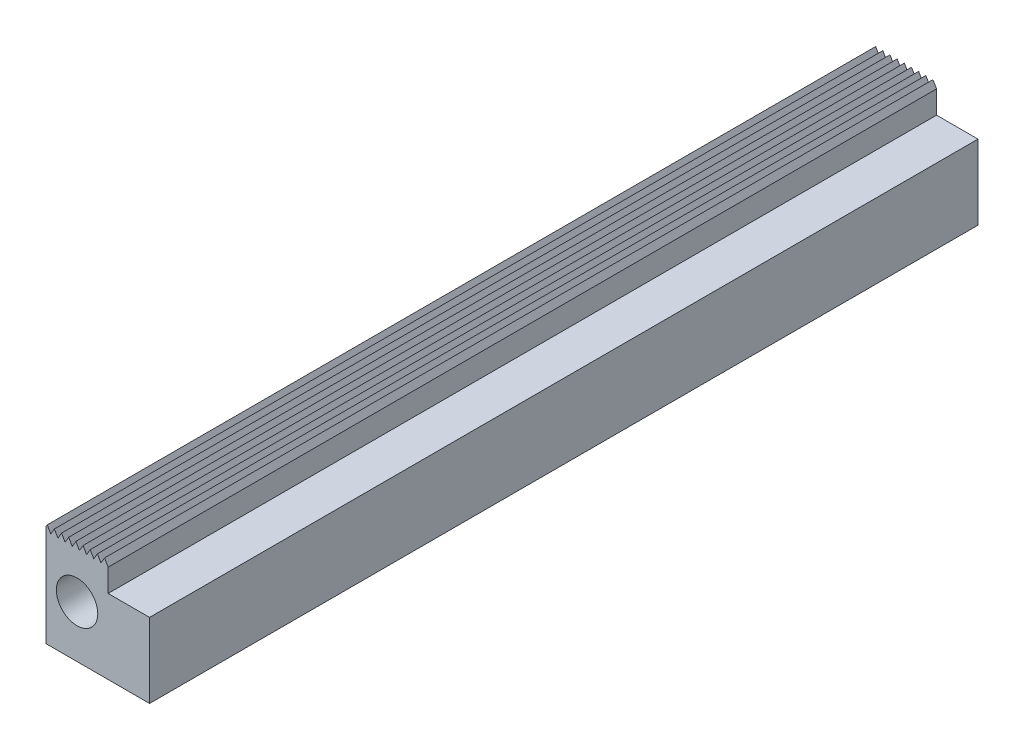
ISO-10303-21;
HEADER;
FILE_DESCRIPTION(('STEP AP214'),'2;1');
FILE_NAME('part.step','',(''),(''),'','','');
FILE_SCHEMA(('AUTOMOTIVE_DESIGN { 1 0 10303 214 1 1 1 1 }'));
ENDSEC;
DATA;
#1=APPLICATION_CONTEXT('core data for automotive mechanical design processes');
#2=APPLICATION_PROTOCOL_DEFINITION('international standard','automotive_design',2000,#1);
#3=PRODUCT_CONTEXT('',#1,'mechanical');
#4=PRODUCT('Part','Part','',(#3));
#5=PRODUCT_RELATED_PRODUCT_CATEGORY('part','',(#4));
#6=PRODUCT_DEFINITION_FORMATION('','',#4);
#7=PRODUCT_DEFINITION_CONTEXT('part definition',#1,'design');
#8=PRODUCT_DEFINITION('design','',#6,#7);
#9=PRODUCT_DEFINITION_SHAPE('','',#8);
#10=(LENGTH_UNIT() NAMED_UNIT(*) SI_UNIT(.MILLI.,.METRE.));
#11=(NAMED_UNIT(*) PLANE_ANGLE_UNIT() SI_UNIT($,.RADIAN.));
#12=(NAMED_UNIT(*) SI_UNIT($,.STERADIAN.) SOLID_ANGLE_UNIT());
#13=UNCERTAINTY_MEASURE_WITH_UNIT(LENGTH_MEASURE(1.E-05),#10,'distance_accuracy_value','');
#14=(GEOMETRIC_REPRESENTATION_CONTEXT(3) GLOBAL_UNCERTAINTY_ASSIGNED_CONTEXT((#13)) GLOBAL_UNIT_ASSIGNED_CONTEXT((#10,
#11,#12)) REPRESENTATION_CONTEXT('',''));
#15=CARTESIAN_POINT('',(0.,0.,0.));
#16=DIRECTION('',(0.,0.,1.));
#17=DIRECTION('',(1.,0.,0.));
#18=AXIS2_PLACEMENT_3D('',#15,#16,#17);
#19=CARTESIAN_POINT('',(-4.18717782649205,2.41746824527002,200.));
#20=DIRECTION('',(0.866025403784439,-0.5,0.));
#21=DIRECTION('',(0.5,0.866025403784439,0.));
#22=AXIS2_PLACEMENT_3D('',#19,#20,#21);
#23=PLANE('',#22);
#24=DIRECTION('',(-0.5,-0.866025403784439,0.));
#25=VECTOR('',#24,1.);
#26=CARTESIAN_POINT('',(-4.18717782649205,2.41746824527002,0.));
#27=LINE('',#26,#25);
#28=CARTESIAN_POINT('',(1.63397459621382,12.4999999999993,0.));
#29=VERTEX_POINT('',#28);
#30=CARTESIAN_POINT('',(0.768974596213908,11.0017760514523,0.));
#31=VERTEX_POINT('',#30);
#32=EDGE_CURVE('E234',#29,#31,#27,.T.);
#33=ORIENTED_EDGE('',*,*,#32,.T.);
#34=DIRECTION('',(0.,0.,-1.));
#35=VECTOR('',#34,1.);
#36=CARTESIAN_POINT('',(0.768974596213908,11.0017760514523,200.));
#37=LINE('',#36,#35);
#38=CARTESIAN_POINT('',(0.768974596213908,11.0017760514523,200.));
#39=VERTEX_POINT('',#38);
#40=EDGE_CURVE('E12',#39,#31,#37,.T.);
#41=ORIENTED_EDGE('',*,*,#40,.F.);
#42=DIRECTION('',(-0.5,-0.866025403784439,0.));
#43=VECTOR('',#42,1.);
#44=CARTESIAN_POINT('',(-4.18717782649205,2.41746824527002,200.));
#45=LINE('',#44,#43);
#46=CARTESIAN_POINT('',(1.63397459621382,12.4999999999993,200.));
#47=VERTEX_POINT('',#46);
#48=EDGE_CURVE('E285',#47,#39,#45,.T.);
#49=ORIENTED_EDGE('',*,*,#48,.F.);
#50=DIRECTION('',(0.,0.,-1.));
#51=VECTOR('',#50,1.);
#52=CARTESIAN_POINT('',(1.63397459621382,12.4999999999993,200.));
#53=LINE('',#52,#51);
#54=EDGE_CURVE('E233',#47,#29,#53,.T.);
#55=ORIENTED_EDGE('',*,*,#54,.T.);
#56=EDGE_LOOP('',(#33,#41,#49,#55));
#57=FACE_BOUND('',#56,.T.);
#58=ADVANCED_FACE('F43',(#57),#23,.F.);
#59=CARTESIAN_POINT('',(5.34063972081292,3.08341978045615,200.));
#60=DIRECTION('',(-0.866025403784439,-0.5,0.));
#61=DIRECTION('',(0.5,-0.866025403784439,0.));
#62=AXIS2_PLACEMENT_3D('',#59,#60,#61);
#63=PLANE('',#62);
#64=DIRECTION('',(-0.5,0.866025403784439,0.));
#65=VECTOR('',#64,1.);
#66=CARTESIAN_POINT('',(5.34063972081292,3.08341978045615,0.));
#67=LINE('',#66,#65);
#68=CARTESIAN_POINT('',(-0.0960254037859938,12.4999999999992,0.));
#69=VERTEX_POINT('',#68);
#70=EDGE_CURVE('E237',#31,#69,#67,.T.);
#71=ORIENTED_EDGE('',*,*,#70,.T.);
#72=DIRECTION('',(0.,0.,-1.));
#73=VECTOR('',#72,1.);
#74=CARTESIAN_POINT('',(-0.0960254037859938,12.4999999999992,200.));
#75=LINE('',#74,#73);
#76=CARTESIAN_POINT('',(-0.0960254037859938,12.4999999999992,200.));
#77=VERTEX_POINT('',#76);
#78=EDGE_CURVE('E51',#77,#69,#75,.T.);
#79=ORIENTED_EDGE('',*,*,#78,.F.);
#80=DIRECTION('',(-0.5,0.866025403784439,0.));
#81=VECTOR('',#80,1.);
#82=CARTESIAN_POINT('',(5.34063972081292,3.08341978045615,200.));
#83=LINE('',#82,#81);
#84=EDGE_CURVE('E146',#39,#77,#83,.T.);
#85=ORIENTED_EDGE('',*,*,#84,.F.);
#86=ORIENTED_EDGE('',*,*,#40,.T.);
#87=EDGE_LOOP('',(#71,#79,#85,#86));
#88=FACE_BOUND('',#87,.T.);
#89=ADVANCED_FACE('F439',(#88),#63,.F.);
#90=CARTESIAN_POINT('',(-5.48467782649251,3.16658021954454,200.));
#91=DIRECTION('',(0.86602540378439,-0.500000000000085,0.));
#92=DIRECTION('',(0.500000000000085,0.86602540378439,0.));
#93=AXIS2_PLACEMENT_3D('',#90,#91,#92);
#94=PLANE('',#93);
#95=DIRECTION('',(-0.500000000000085,-0.86602540378439,0.));
#96=VECTOR('',#95,1.);
#97=CARTESIAN_POINT('',(-5.48467782649251,3.16658021954454,0.));
#98=LINE('',#97,#96);
#99=CARTESIAN_POINT('',(-0.961025403786092,11.0017760514523,0.));
#100=VERTEX_POINT('',#99);
#101=EDGE_CURVE('E240',#69,#100,#98,.T.);
#102=ORIENTED_EDGE('',*,*,#101,.T.);
#103=DIRECTION('',(0.,0.,-1.));
#104=VECTOR('',#103,1.);
#105=CARTESIAN_POINT('',(-0.961025403786092,11.0017760514523,200.));
#106=LINE('',#105,#104);
#107=CARTESIAN_POINT('',(-0.961025403786092,11.0017760514523,200.));
#108=VERTEX_POINT('',#107);
#109=EDGE_CURVE('E306',#108,#100,#106,.T.);
#110=ORIENTED_EDGE('',*,*,#109,.F.);
#111=DIRECTION('',(-0.500000000000085,-0.86602540378439,0.));
#112=VECTOR('',#111,1.);
#113=CARTESIAN_POINT('',(-5.48467782649251,3.16658021954454,200.));
#114=LINE('',#113,#112);
#115=EDGE_CURVE('E452',#77,#108,#114,.T.);
#116=ORIENTED_EDGE('',*,*,#115,.F.);
#117=ORIENTED_EDGE('',*,*,#78,.T.);
#118=EDGE_LOOP('',(#102,#110,#116,#117));
#119=FACE_BOUND('',#118,.T.);
#120=ADVANCED_FACE('F444',(#119),#94,.F.);
#121=CARTESIAN_POINT('',(4.04313972081292,2.33430780618261,200.));
#122=DIRECTION('',(-0.866025403784439,-0.5,0.));
#123=DIRECTION('',(0.5,-0.866025403784439,0.));
#124=AXIS2_PLACEMENT_3D('',#121,#122,#123);
#125=PLANE('',#124);
#126=DIRECTION('',(-0.5,0.866025403784439,0.));
#127=VECTOR('',#126,1.);
#128=CARTESIAN_POINT('',(4.04313972081292,2.33430780618261,0.));
#129=LINE('',#128,#127);
#130=CARTESIAN_POINT('',(-1.82602540378599,12.4999999999992,0.));
#131=VERTEX_POINT('',#130);
#132=EDGE_CURVE('E242',#100,#131,#129,.T.);
#133=ORIENTED_EDGE('',*,*,#132,.T.);
#134=DIRECTION('',(0.,0.,-1.));
#135=VECTOR('',#134,1.);
#136=CARTESIAN_POINT('',(-1.82602540378599,12.4999999999992,200.));
#137=LINE('',#136,#135);
#138=CARTESIAN_POINT('',(-1.82602540378599,12.4999999999992,200.));
#139=VERTEX_POINT('',#138);
#140=EDGE_CURVE('E303',#139,#131,#137,.T.);
#141=ORIENTED_EDGE('',*,*,#140,.F.);
#142=DIRECTION('',(-0.5,0.866025403784439,0.));
#143=VECTOR('',#142,1.);
#144=CARTESIAN_POINT('',(4.04313972081292,2.33430780618261,200.));
#145=LINE('',#144,#143);
#146=EDGE_CURVE('E454',#108,#139,#145,.T.);
#147=ORIENTED_EDGE('',*,*,#146,.F.);
#148=ORIENTED_EDGE('',*,*,#109,.T.);
#149=EDGE_LOOP('',(#133,#141,#147,#148));
#150=FACE_BOUND('',#149,.T.);
#151=ADVANCED_FACE('F477',(#150),#125,.F.);
#152=CARTESIAN_POINT('',(-6.78217782649191,3.91569219381701,200.));
#153=DIRECTION('',(0.866025403784439,-0.5,0.));
#154=DIRECTION('',(0.5,0.866025403784439,0.));
#155=AXIS2_PLACEMENT_3D('',#152,#153,#154);
#156=PLANE('',#155);
#157=DIRECTION('',(-0.5,-0.866025403784439,0.));
#158=VECTOR('',#157,1.);
#159=CARTESIAN_POINT('',(-6.78217782649191,3.91569219381701,0.));
#160=LINE('',#159,#158);
#161=CARTESIAN_POINT('',(-2.6910254037859,11.0017760514523,0.));
#162=VERTEX_POINT('',#161);
#163=EDGE_CURVE('E244',#131,#162,#160,.T.);
#164=ORIENTED_EDGE('',*,*,#163,.T.);
#165=DIRECTION('',(0.,0.,-1.));
#166=VECTOR('',#165,1.);
#167=CARTESIAN_POINT('',(-2.6910254037859,11.0017760514523,200.));
#168=LINE('',#167,#166);
#169=CARTESIAN_POINT('',(-2.6910254037859,11.0017760514523,200.));
#170=VERTEX_POINT('',#169);
#171=EDGE_CURVE('E299',#170,#162,#168,.T.);
#172=ORIENTED_EDGE('',*,*,#171,.F.);
#173=DIRECTION('',(-0.5,-0.866025403784439,0.));
#174=VECTOR('',#173,1.);
#175=CARTESIAN_POINT('',(-6.78217782649191,3.91569219381701,200.));
#176=LINE('',#175,#174);
#177=EDGE_CURVE('E456',#139,#170,#176,.T.);
#178=ORIENTED_EDGE('',*,*,#177,.F.);
#179=ORIENTED_EDGE('',*,*,#140,.T.);
#180=EDGE_LOOP('',(#164,#172,#178,#179));
#181=FACE_BOUND('',#180,.T.);
#182=ADVANCED_FACE('F473',(#181),#156,.F.);
#183=CARTESIAN_POINT('',(2.74563972081305,1.58519583190915,200.));
#184=DIRECTION('',(-0.866025403784439,-0.5,0.));
#185=DIRECTION('',(0.5,-0.866025403784439,0.));
#186=AXIS2_PLACEMENT_3D('',#183,#184,#185);
#187=PLANE('',#186);
#188=DIRECTION('',(-0.5,0.866025403784439,0.));
#189=VECTOR('',#188,1.);
#190=CARTESIAN_POINT('',(2.74563972081305,1.58519583190915,0.));
#191=LINE('',#190,#189);
#192=CARTESIAN_POINT('',(-3.5560254037858,12.4999999999992,0.));
#193=VERTEX_POINT('',#192);
#194=EDGE_CURVE('E246',#162,#193,#191,.T.);
#195=ORIENTED_EDGE('',*,*,#194,.T.);
#196=DIRECTION('',(0.,0.,-1.));
#197=VECTOR('',#196,1.);
#198=CARTESIAN_POINT('',(-3.5560254037858,12.4999999999992,200.));
#199=LINE('',#198,#197);
#200=CARTESIAN_POINT('',(-3.5560254037858,12.4999999999992,200.));
#201=VERTEX_POINT('',#200);
#202=EDGE_CURVE('E294',#201,#193,#199,.T.);
#203=ORIENTED_EDGE('',*,*,#202,.F.);
#204=DIRECTION('',(-0.5,0.866025403784439,0.));
#205=VECTOR('',#204,1.);
#206=CARTESIAN_POINT('',(2.74563972081305,1.58519583190915,200.));
#207=LINE('',#206,#205);
#208=EDGE_CURVE('E462',#170,#201,#207,.T.);
#209=ORIENTED_EDGE('',*,*,#208,.F.);
#210=ORIENTED_EDGE('',*,*,#171,.T.);
#211=EDGE_LOOP('',(#195,#203,#209,#210));
#212=FACE_BOUND('',#211,.T.);
#213=ADVANCED_FACE('F469',(#212),#187,.F.);
#214=CARTESIAN_POINT('',(-8.07967782649176,4.66480416809047,200.));
#215=DIRECTION('',(0.866025403784439,-0.5,0.));
#216=DIRECTION('',(0.5,0.866025403784439,0.));
#217=AXIS2_PLACEMENT_3D('',#214,#215,#216);
#218=PLANE('',#217);
#219=DIRECTION('',(-0.5,-0.866025403784439,0.));
#220=VECTOR('',#219,1.);
#221=CARTESIAN_POINT('',(-8.07967782649176,4.66480416809047,0.));
#222=LINE('',#221,#220);
#223=CARTESIAN_POINT('',(-4.42102540378571,11.0017760514523,0.));
#224=VERTEX_POINT('',#223);
#225=EDGE_CURVE('E248',#193,#224,#222,.T.);
#226=ORIENTED_EDGE('',*,*,#225,.T.);
#227=DIRECTION('',(0.,0.,-1.));
#228=VECTOR('',#227,1.);
#229=CARTESIAN_POINT('',(-4.42102540378571,11.0017760514523,200.));
#230=LINE('',#229,#228);
#231=CARTESIAN_POINT('',(-4.42102540378571,11.0017760514523,200.));
#232=VERTEX_POINT('',#231);
#233=EDGE_CURVE('E300',#232,#224,#230,.T.);
#234=ORIENTED_EDGE('',*,*,#233,.F.);
#235=DIRECTION('',(-0.5,-0.866025403784439,0.));
#236=VECTOR('',#235,1.);
#237=CARTESIAN_POINT('',(-8.07967782649176,4.66480416809047,200.));
#238=LINE('',#237,#236);
#239=EDGE_CURVE('E464',#201,#232,#238,.T.);
#240=ORIENTED_EDGE('',*,*,#239,.F.);
#241=ORIENTED_EDGE('',*,*,#202,.T.);
#242=EDGE_LOOP('',(#226,#234,#240,#241));
#243=FACE_BOUND('',#242,.T.);
#244=ADVANCED_FACE('F467',(#243),#218,.F.);
#245=CARTESIAN_POINT('',(1.44813972081319,0.836083857635685,200.));
#246=DIRECTION('',(-0.866025403784439,-0.5,0.));
#247=DIRECTION('',(0.5,-0.866025403784439,0.));
#248=AXIS2_PLACEMENT_3D('',#245,#246,#247);
#249=PLANE('',#248);
#250=DIRECTION('',(-0.5,0.866025403784439,0.));
#251=VECTOR('',#250,1.);
#252=CARTESIAN_POINT('',(1.44813972081319,0.836083857635685,0.));
#253=LINE('',#252,#251);
#254=CARTESIAN_POINT('',(-5.28602540378561,12.4999999999992,0.));
#255=VERTEX_POINT('',#254);
#256=EDGE_CURVE('E250',#224,#255,#253,.T.);
#257=ORIENTED_EDGE('',*,*,#256,.T.);
#258=DIRECTION('',(0.,0.,-1.));
#259=VECTOR('',#258,1.);
#260=CARTESIAN_POINT('',(-5.28602540378561,12.4999999999992,200.));
#261=LINE('',#260,#259);
#262=CARTESIAN_POINT('',(-5.28602540378561,12.4999999999992,200.));
#263=VERTEX_POINT('',#262);
#264=EDGE_CURVE('E323',#263,#255,#261,.T.);
#265=ORIENTED_EDGE('',*,*,#264,.F.);
#266=DIRECTION('',(-0.5,0.866025403784439,0.));
#267=VECTOR('',#266,1.);
#268=CARTESIAN_POINT('',(1.44813972081319,0.836083857635685,200.));
#269=LINE('',#268,#267);
#270=EDGE_CURVE('E336',#232,#263,#269,.T.);
#271=ORIENTED_EDGE('',*,*,#270,.F.);
#272=ORIENTED_EDGE('',*,*,#233,.T.);
#273=EDGE_LOOP('',(#257,#265,#271,#272));
#274=FACE_BOUND('',#273,.T.);
#275=ADVANCED_FACE('F335',(#274),#249,.F.);
#276=CARTESIAN_POINT('',(-9.37717782649161,5.41391614236393,200.));
#277=DIRECTION('',(0.866025403784438,-0.5,0.));
#278=DIRECTION('',(0.5,0.866025403784439,0.));
#279=AXIS2_PLACEMENT_3D('',#276,#277,#278);
#280=PLANE('',#279);
#281=DIRECTION('',(-0.5,-0.866025403784439,0.));
#282=VECTOR('',#281,1.);
#283=CARTESIAN_POINT('',(-9.37717782649161,5.41391614236393,0.));
#284=LINE('',#283,#282);
#285=CARTESIAN_POINT('',(-6.15102540378552,11.0017760514523,0.));
#286=VERTEX_POINT('',#285);
#287=EDGE_CURVE('E252',#255,#286,#284,.T.);
#288=ORIENTED_EDGE('',*,*,#287,.T.);
#289=DIRECTION('',(0.,0.,-1.));
#290=VECTOR('',#289,1.);
#291=CARTESIAN_POINT('',(-6.15102540378552,11.0017760514523,200.));
#292=LINE('',#291,#290);
#293=CARTESIAN_POINT('',(-6.15102540378552,11.0017760514523,200.));
#294=VERTEX_POINT('',#293);
#295=EDGE_CURVE('E319',#294,#286,#292,.T.);
#296=ORIENTED_EDGE('',*,*,#295,.F.);
#297=DIRECTION('',(-0.5,-0.866025403784439,0.));
#298=VECTOR('',#297,1.);
#299=CARTESIAN_POINT('',(-9.37717782649161,5.41391614236393,200.));
#300=LINE('',#299,#298);
#301=EDGE_CURVE('E356',#263,#294,#300,.T.);
#302=ORIENTED_EDGE('',*,*,#301,.F.);
#303=ORIENTED_EDGE('',*,*,#264,.T.);
#304=EDGE_LOOP('',(#288,#296,#302,#303));
#305=FACE_BOUND('',#304,.T.);
#306=ADVANCED_FACE('F348',(#305),#280,.F.);
#307=CARTESIAN_POINT('',(0.150639720813329,0.0869718833622257,200.));
#308=DIRECTION('',(-0.866025403784439,-0.5,0.));
#309=DIRECTION('',(0.5,-0.866025403784439,0.));
#310=AXIS2_PLACEMENT_3D('',#307,#308,#309);
#311=PLANE('',#310);
#312=DIRECTION('',(-0.5,0.866025403784439,0.));
#313=VECTOR('',#312,1.);
#314=CARTESIAN_POINT('',(0.150639720813329,0.0869718833622257,0.));
#315=LINE('',#314,#313);
#316=CARTESIAN_POINT('',(-7.01602540378542,12.4999999999992,0.));
#317=VERTEX_POINT('',#316);
#318=EDGE_CURVE('E254',#286,#317,#315,.T.);
#319=ORIENTED_EDGE('',*,*,#318,.T.);
#320=DIRECTION('',(0.,0.,-1.));
#321=VECTOR('',#320,1.);
#322=CARTESIAN_POINT('',(-7.01602540378542,12.4999999999992,200.));
#323=LINE('',#322,#321);
#324=CARTESIAN_POINT('',(-7.01602540378542,12.4999999999992,200.));
#325=VERTEX_POINT('',#324);
#326=EDGE_CURVE('E314',#325,#317,#323,.T.);
#327=ORIENTED_EDGE('',*,*,#326,.F.);
#328=DIRECTION('',(-0.5,0.866025403784439,0.));
#329=VECTOR('',#328,1.);
#330=CARTESIAN_POINT('',(0.150639720813329,0.0869718833622257,200.));
#331=LINE('',#330,#329);
#332=EDGE_CURVE('E353',#294,#325,#331,.T.);
#333=ORIENTED_EDGE('',*,*,#332,.F.);
#334=ORIENTED_EDGE('',*,*,#295,.T.);
#335=EDGE_LOOP('',(#319,#327,#333,#334));
#336=FACE_BOUND('',#335,.T.);
#337=ADVANCED_FACE('F351',(#336),#311,.F.);
#338=CARTESIAN_POINT('',(-10.6746778264915,6.16302811663738,200.));
#339=DIRECTION('',(0.866025403784438,-0.5,0.));
#340=DIRECTION('',(0.5,0.866025403784439,0.));
#341=AXIS2_PLACEMENT_3D('',#338,#339,#340);
#342=PLANE('',#341);
#343=DIRECTION('',(-0.5,-0.866025403784439,0.));
#344=VECTOR('',#343,1.);
#345=CARTESIAN_POINT('',(-10.6746778264915,6.16302811663738,0.));
#346=LINE('',#345,#344);
#347=CARTESIAN_POINT('',(-7.88102540378533,11.0017760514523,0.));
#348=VERTEX_POINT('',#347);
#349=EDGE_CURVE('E256',#317,#348,#346,.T.);
#350=ORIENTED_EDGE('',*,*,#349,.T.);
#351=DIRECTION('',(0.,0.,-1.));
#352=VECTOR('',#351,1.);
#353=CARTESIAN_POINT('',(-7.88102540378533,11.0017760514523,200.));
#354=LINE('',#353,#352);
#355=CARTESIAN_POINT('',(-7.88102540378533,11.0017760514523,200.));
#356=VERTEX_POINT('',#355);
#357=EDGE_CURVE('E320',#356,#348,#354,.T.);
#358=ORIENTED_EDGE('',*,*,#357,.F.);
#359=DIRECTION('',(-0.5,-0.866025403784439,0.));
#360=VECTOR('',#359,1.);
#361=CARTESIAN_POINT('',(-10.6746778264915,6.16302811663738,200.));
#362=LINE('',#361,#360);
#363=EDGE_CURVE('E355',#325,#356,#362,.T.);
#364=ORIENTED_EDGE('',*,*,#363,.F.);
#365=ORIENTED_EDGE('',*,*,#326,.T.);
#366=EDGE_LOOP('',(#350,#358,#364,#365));
#367=FACE_BOUND('',#366,.T.);
#368=ADVANCED_FACE('F429',(#367),#342,.F.);
#369=CARTESIAN_POINT('',(-1.14686027918653,-0.662140090911234,200.));
#370=DIRECTION('',(-0.866025403784439,-0.5,0.));
#371=DIRECTION('',(0.5,-0.866025403784439,0.));
#372=AXIS2_PLACEMENT_3D('',#369,#370,#371);
#373=PLANE('',#372);
#374=DIRECTION('',(-0.5,0.866025403784439,0.));
#375=VECTOR('',#374,1.);
#376=CARTESIAN_POINT('',(-1.14686027918653,-0.662140090911234,0.));
#377=LINE('',#376,#375);
#378=CARTESIAN_POINT('',(-8.74602540378523,12.4999999999992,0.));
#379=VERTEX_POINT('',#378);
#380=EDGE_CURVE('E258',#348,#379,#377,.T.);
#381=ORIENTED_EDGE('',*,*,#380,.T.);
#382=DIRECTION('',(0.,0.,-1.));
#383=VECTOR('',#382,1.);
#384=CARTESIAN_POINT('',(-8.74602540378523,12.4999999999992,200.));
#385=LINE('',#384,#383);
#386=CARTESIAN_POINT('',(-8.74602540378523,12.4999999999992,200.));
#387=VERTEX_POINT('',#386);
#388=EDGE_CURVE('E405',#387,#379,#385,.T.);
#389=ORIENTED_EDGE('',*,*,#388,.F.);
#390=DIRECTION('',(-0.5,0.866025403784439,0.));
#391=VECTOR('',#390,1.);
#392=CARTESIAN_POINT('',(-1.14686027918653,-0.662140090911234,200.));
#393=LINE('',#392,#391);
#394=EDGE_CURVE('E358',#356,#387,#393,.T.);
#395=ORIENTED_EDGE('',*,*,#394,.F.);
#396=ORIENTED_EDGE('',*,*,#357,.T.);
#397=EDGE_LOOP('',(#381,#389,#395,#396));
#398=FACE_BOUND('',#397,.T.);
#399=ADVANCED_FACE('F417',(#398),#373,.F.);
#400=CARTESIAN_POINT('',(-11.9721778264913,6.91214009091083,200.));
#401=DIRECTION('',(0.866025403784438,-0.5,0.));
#402=DIRECTION('',(0.5,0.866025403784439,0.));
#403=AXIS2_PLACEMENT_3D('',#400,#401,#402);
#404=PLANE('',#403);
#405=DIRECTION('',(-0.5,-0.866025403784439,0.));
#406=VECTOR('',#405,1.);
#407=CARTESIAN_POINT('',(-11.9721778264913,6.91214009091083,0.));
#408=LINE('',#407,#406);
#409=CARTESIAN_POINT('',(-9.61102540378514,11.0017760514523,0.));
#410=VERTEX_POINT('',#409);
#411=EDGE_CURVE('E260',#379,#410,#408,.T.);
#412=ORIENTED_EDGE('',*,*,#411,.T.);
#413=DIRECTION('',(0.,0.,-1.));
#414=VECTOR('',#413,1.);
#415=CARTESIAN_POINT('',(-9.61102540378514,11.0017760514523,200.));
#416=LINE('',#415,#414);
#417=CARTESIAN_POINT('',(-9.61102540378514,11.0017760514523,200.));
#418=VERTEX_POINT('',#417);
#419=EDGE_CURVE('E403',#418,#410,#416,.T.);
#420=ORIENTED_EDGE('',*,*,#419,.F.);
#421=DIRECTION('',(-0.5,-0.866025403784439,0.));
#422=VECTOR('',#421,1.);
#423=CARTESIAN_POINT('',(-11.9721778264913,6.91214009091083,200.));
#424=LINE('',#423,#422);
#425=EDGE_CURVE('E364',#387,#418,#424,.T.);
#426=ORIENTED_EDGE('',*,*,#425,.F.);
#427=ORIENTED_EDGE('',*,*,#388,.T.);
#428=EDGE_LOOP('',(#412,#420,#426,#427));
#429=FACE_BOUND('',#428,.T.);
#430=ADVANCED_FACE('F422',(#429),#404,.F.);
#431=CARTESIAN_POINT('',(-2.44436027918639,-1.41125206518469,200.));
#432=DIRECTION('',(-0.866025403784439,-0.5,0.));
#433=DIRECTION('',(0.5,-0.866025403784439,0.));
#434=AXIS2_PLACEMENT_3D('',#431,#432,#433);
#435=PLANE('',#434);
#436=DIRECTION('',(-0.5,0.866025403784439,0.));
#437=VECTOR('',#436,1.);
#438=CARTESIAN_POINT('',(-2.44436027918639,-1.41125206518469,0.));
#439=LINE('',#438,#437);
#440=CARTESIAN_POINT('',(-10.476025403785,12.4999999999992,0.));
#441=VERTEX_POINT('',#440);
#442=EDGE_CURVE('E262',#410,#441,#439,.T.);
#443=ORIENTED_EDGE('',*,*,#442,.T.);
#444=DIRECTION('',(0.,0.,-1.));
#445=VECTOR('',#444,1.);
#446=CARTESIAN_POINT('',(-10.476025403785,12.4999999999992,200.));
#447=LINE('',#446,#445);
#448=CARTESIAN_POINT('',(-10.476025403785,12.4999999999992,200.));
#449=VERTEX_POINT('',#448);
#450=EDGE_CURVE('E399',#449,#441,#447,.T.);
#451=ORIENTED_EDGE('',*,*,#450,.F.);
#452=DIRECTION('',(-0.5,0.866025403784439,0.));
#453=VECTOR('',#452,1.);
#454=CARTESIAN_POINT('',(-2.44436027918639,-1.41125206518469,200.));
#455=LINE('',#454,#453);
#456=EDGE_CURVE('E366',#418,#449,#455,.T.);
#457=ORIENTED_EDGE('',*,*,#456,.F.);
#458=ORIENTED_EDGE('',*,*,#419,.T.);
#459=EDGE_LOOP('',(#443,#451,#457,#458));
#460=FACE_BOUND('',#459,.T.);
#461=ADVANCED_FACE('F425',(#460),#435,.F.);
#462=CARTESIAN_POINT('',(-13.2696778264912,7.66125206518429,200.));
#463=DIRECTION('',(0.866025403784438,-0.5,0.));
#464=DIRECTION('',(0.5,0.866025403784439,0.));
#465=AXIS2_PLACEMENT_3D('',#462,#463,#464);
#466=PLANE('',#465);
#467=DIRECTION('',(-0.5,-0.866025403784439,0.));
#468=VECTOR('',#467,1.);
#469=CARTESIAN_POINT('',(-13.2696778264912,7.66125206518429,0.));
#470=LINE('',#469,#468);
#471=CARTESIAN_POINT('',(-11.341025403785,11.0017760514523,0.));
#472=VERTEX_POINT('',#471);
#473=EDGE_CURVE('E264',#441,#472,#470,.T.);
#474=ORIENTED_EDGE('',*,*,#473,.T.);
#475=DIRECTION('',(0.,0.,-1.));
#476=VECTOR('',#475,1.);
#477=CARTESIAN_POINT('',(-11.341025403785,11.0017760514523,200.));
#478=LINE('',#477,#476);
#479=CARTESIAN_POINT('',(-11.341025403785,11.0017760514523,200.));
#480=VERTEX_POINT('',#479);
#481=EDGE_CURVE('E397',#480,#472,#478,.T.);
#482=ORIENTED_EDGE('',*,*,#481,.F.);
#483=DIRECTION('',(-0.5,-0.866025403784439,0.));
#484=VECTOR('',#483,1.);
#485=CARTESIAN_POINT('',(-13.2696778264912,7.66125206518429,200.));
#486=LINE('',#485,#484);
#487=EDGE_CURVE('E368',#449,#480,#486,.T.);
#488=ORIENTED_EDGE('',*,*,#487,.F.);
#489=ORIENTED_EDGE('',*,*,#450,.T.);
#490=EDGE_LOOP('',(#474,#482,#488,#489));
#491=FACE_BOUND('',#490,.T.);
#492=ADVANCED_FACE('F529',(#491),#466,.F.);
#493=CARTESIAN_POINT('',(-3.74186027918626,-2.16036403945816,200.));
#494=DIRECTION('',(-0.866025403784439,-0.5,0.));
#495=DIRECTION('',(0.5,-0.866025403784439,0.));
#496=AXIS2_PLACEMENT_3D('',#493,#494,#495);
#497=PLANE('',#496);
#498=DIRECTION('',(-0.5,0.866025403784439,0.));
#499=VECTOR('',#498,1.);
#500=CARTESIAN_POINT('',(-3.74186027918626,-2.16036403945816,0.));
#501=LINE('',#500,#499);
#502=CARTESIAN_POINT('',(-12.2060254037849,12.4999999999992,0.));
#503=VERTEX_POINT('',#502);
#504=EDGE_CURVE('E266',#472,#503,#501,.T.);
#505=ORIENTED_EDGE('',*,*,#504,.T.);
#506=DIRECTION('',(0.,0.,-1.));
#507=VECTOR('',#506,1.);
#508=CARTESIAN_POINT('',(-12.2060254037849,12.4999999999992,200.));
#509=LINE('',#508,#507);
#510=CARTESIAN_POINT('',(-12.2060254037849,12.4999999999992,200.));
#511=VERTEX_POINT('',#510);
#512=EDGE_CURVE('E394',#511,#503,#509,.T.);
#513=ORIENTED_EDGE('',*,*,#512,.F.);
#514=DIRECTION('',(-0.5,0.866025403784439,0.));
#515=VECTOR('',#514,1.);
#516=CARTESIAN_POINT('',(-3.74186027918626,-2.16036403945816,200.));
#517=LINE('',#516,#515);
#518=EDGE_CURVE('E370',#480,#511,#517,.T.);
#519=ORIENTED_EDGE('',*,*,#518,.F.);
#520=ORIENTED_EDGE('',*,*,#481,.T.);
#521=EDGE_LOOP('',(#505,#513,#519,#520));
#522=FACE_BOUND('',#521,.T.);
#523=ADVANCED_FACE('F538',(#522),#497,.F.);
#524=CARTESIAN_POINT('',(-14.5671778264909,8.41036403945807,200.));
#525=DIRECTION('',(0.866025403784429,-0.500000000000017,0.));
#526=DIRECTION('',(0.500000000000017,0.866025403784429,0.));
#527=AXIS2_PLACEMENT_3D('',#524,#525,#526);
#528=PLANE('',#527);
#529=DIRECTION('',(-0.500000000000017,-0.866025403784429,0.));
#530=VECTOR('',#529,1.);
#531=CARTESIAN_POINT('',(-14.5671778264909,8.41036403945807,0.));
#532=LINE('',#531,#530);
#533=CARTESIAN_POINT('',(-12.5,11.99082106322,0.));
#534=VERTEX_POINT('',#533);
#535=EDGE_CURVE('E268',#503,#534,#532,.T.);
#536=ORIENTED_EDGE('',*,*,#535,.T.);
#537=DIRECTION('',(0.,0.,-1.));
#538=VECTOR('',#537,1.);
#539=CARTESIAN_POINT('',(-12.5,11.99082106322,200.));
#540=LINE('',#539,#538);
#541=CARTESIAN_POINT('',(-12.5,11.99082106322,200.));
#542=VERTEX_POINT('',#541);
#543=EDGE_CURVE('E392',#542,#534,#540,.T.);
#544=ORIENTED_EDGE('',*,*,#543,.F.);
#545=DIRECTION('',(-0.500000000000017,-0.866025403784429,0.));
#546=VECTOR('',#545,1.);
#547=CARTESIAN_POINT('',(-14.5671778264909,8.41036403945807,200.));
#548=LINE('',#547,#546);
#549=EDGE_CURVE('E372',#511,#542,#548,.T.);
#550=ORIENTED_EDGE('',*,*,#549,.F.);
#551=ORIENTED_EDGE('',*,*,#512,.T.);
#552=EDGE_LOOP('',(#536,#544,#550,#551));
#553=FACE_BOUND('',#552,.T.);
#554=ADVANCED_FACE('F548',(#553),#528,.F.);
#555=CARTESIAN_POINT('',(-12.5,0.,200.));
#556=DIRECTION('',(-1.,0.,0.));
#557=DIRECTION('',(0.,-1.,0.));
#558=AXIS2_PLACEMENT_3D('',#555,#556,#557);
#559=PLANE('',#558);
#560=DIRECTION('',(0.,1.,0.));
#561=VECTOR('',#560,1.);
#562=CARTESIAN_POINT('',(-12.5,0.,0.));
#563=LINE('',#562,#561);
#564=CARTESIAN_POINT('',(-12.5,-12.5,0.));
#565=VERTEX_POINT('',#564);
#566=EDGE_CURVE('E271',#565,#534,#563,.T.);
#567=ORIENTED_EDGE('',*,*,#566,.F.);
#568=DIRECTION('',(0.,0.,-1.));
#569=VECTOR('',#568,1.);
#570=CARTESIAN_POINT('',(-12.5,-12.5,200.));
#571=LINE('',#570,#569);
#572=CARTESIAN_POINT('',(-12.5,-12.5,200.));
#573=VERTEX_POINT('',#572);
#574=EDGE_CURVE('E386',#573,#565,#571,.T.);
#575=ORIENTED_EDGE('',*,*,#574,.F.);
#576=DIRECTION('',(0.,1.,0.));
#577=VECTOR('',#576,1.);
#578=CARTESIAN_POINT('',(-12.5,0.,200.));
#579=LINE('',#578,#577);
#580=EDGE_CURVE('E374',#573,#542,#579,.T.);
#581=ORIENTED_EDGE('',*,*,#580,.T.);
#582=ORIENTED_EDGE('',*,*,#543,.T.);
#583=EDGE_LOOP('',(#567,#575,#581,#582));
#584=FACE_BOUND('',#583,.T.);
#585=ADVANCED_FACE('F558',(#584),#559,.T.);
#586=CARTESIAN_POINT('',(0.,-12.5,200.));
#587=DIRECTION('',(0.,1.,0.));
#588=DIRECTION('',(0.,0.,1.));
#589=AXIS2_PLACEMENT_3D('',#586,#587,#588);
#590=PLANE('',#589);
#591=CARTESIAN_POINT('',(0.,-12.5,140.));
#592=DIRECTION('',(0.,-1.,0.));
#593=DIRECTION('',(0.,0.,-1.));
#594=AXIS2_PLACEMENT_3D('',#591,#592,#593);
#595=CIRCLE('',#594,2.5);
#596=CARTESIAN_POINT('',(0.,-12.5,137.5));
#597=VERTEX_POINT('',#596);
#598=EDGE_CURVE('E686',#597,#597,#595,.T.);
#599=ORIENTED_EDGE('',*,*,#598,.F.);
#600=EDGE_LOOP('',(#599));
#601=FACE_BOUND('',#600,.T.);
#602=CARTESIAN_POINT('',(0.,-12.5,60.));
#603=DIRECTION('',(0.,-1.,0.));
#604=DIRECTION('',(0.,0.,1.));
#605=AXIS2_PLACEMENT_3D('',#602,#603,#604);
#606=CIRCLE('',#605,2.5);
#607=CARTESIAN_POINT('',(0.,-12.5,62.5));
#608=VERTEX_POINT('',#607);
#609=EDGE_CURVE('E694',#608,#608,#606,.T.);
#610=ORIENTED_EDGE('',*,*,#609,.F.);
#611=EDGE_LOOP('',(#610));
#612=FACE_BOUND('',#611,.T.);
#613=DIRECTION('',(1.,0.,0.));
#614=VECTOR('',#613,1.);
#615=CARTESIAN_POINT('',(0.,-12.5,0.));
#616=LINE('',#615,#614);
#617=CARTESIAN_POINT('',(12.5,-12.5,0.));
#618=VERTEX_POINT('',#617);
#619=EDGE_CURVE('E274',#565,#618,#616,.T.);
#620=ORIENTED_EDGE('',*,*,#619,.T.);
#621=DIRECTION('',(0.,0.,-1.));
#622=VECTOR('',#621,1.);
#623=CARTESIAN_POINT('',(12.5,-12.5,200.));
#624=LINE('',#623,#622);
#625=CARTESIAN_POINT('',(12.5,-12.5,200.));
#626=VERTEX_POINT('',#625);
#627=EDGE_CURVE('E381',#626,#618,#624,.T.);
#628=ORIENTED_EDGE('',*,*,#627,.F.);
#629=DIRECTION('',(1.,0.,0.));
#630=VECTOR('',#629,1.);
#631=CARTESIAN_POINT('',(0.,-12.5,200.));
#632=LINE('',#631,#630);
#633=EDGE_CURVE('E225',#573,#626,#632,.T.);
#634=ORIENTED_EDGE('',*,*,#633,.F.);
#635=ORIENTED_EDGE('',*,*,#574,.T.);
#636=EDGE_LOOP('',(#620,#628,#634,#635));
#637=FACE_BOUND('',#636,.T.);
#638=ADVANCED_FACE('F382',(#601,#612,#637),#590,.F.);
#639=CARTESIAN_POINT('',(12.5,0.,200.));
#640=DIRECTION('',(-1.,0.,0.));
#641=DIRECTION('',(0.,0.,1.));
#642=AXIS2_PLACEMENT_3D('',#639,#640,#641);
#643=PLANE('',#642);
#644=DIRECTION('',(0.,1.,0.));
#645=VECTOR('',#644,1.);
#646=CARTESIAN_POINT('',(12.5,0.,0.));
#647=LINE('',#646,#645);
#648=CARTESIAN_POINT('',(12.5,5.5,0.));
#649=VERTEX_POINT('',#648);
#650=EDGE_CURVE('E276',#618,#649,#647,.T.);
#651=ORIENTED_EDGE('',*,*,#650,.T.);
#652=DIRECTION('',(0.,0.,-1.));
#653=VECTOR('',#652,1.);
#654=CARTESIAN_POINT('',(12.5,5.5,200.));
#655=LINE('',#654,#653);
#656=CARTESIAN_POINT('',(12.5,5.5,200.));
#657=VERTEX_POINT('',#656);
#658=EDGE_CURVE('E213',#657,#649,#655,.T.);
#659=ORIENTED_EDGE('',*,*,#658,.F.);
#660=DIRECTION('',(0.,1.,0.));
#661=VECTOR('',#660,1.);
#662=CARTESIAN_POINT('',(12.5,0.,200.));
#663=LINE('',#662,#661);
#664=EDGE_CURVE('E222',#626,#657,#663,.T.);
#665=ORIENTED_EDGE('',*,*,#664,.F.);
#666=ORIENTED_EDGE('',*,*,#627,.T.);
#667=EDGE_LOOP('',(#651,#659,#665,#666));
#668=FACE_BOUND('',#667,.T.);
#669=ADVANCED_FACE('F388',(#668),#643,.F.);
#670=CARTESIAN_POINT('',(0.,5.5,200.));
#671=DIRECTION('',(0.,1.,0.));
#672=DIRECTION('',(-1.,0.,0.));
#673=AXIS2_PLACEMENT_3D('',#670,#671,#672);
#674=PLANE('',#673);
#675=DIRECTION('',(1.,0.,0.));
#676=VECTOR('',#675,1.);
#677=CARTESIAN_POINT('',(0.,5.5,0.));
#678=LINE('',#677,#676);
#679=CARTESIAN_POINT('',(2.5,5.5,0.));
#680=VERTEX_POINT('',#679);
#681=EDGE_CURVE('E212',#680,#649,#678,.T.);
#682=ORIENTED_EDGE('',*,*,#681,.F.);
#683=DIRECTION('',(0.,0.,-1.));
#684=VECTOR('',#683,1.);
#685=CARTESIAN_POINT('',(2.5,5.5,200.));
#686=LINE('',#685,#684);
#687=CARTESIAN_POINT('',(2.5,5.5,200.));
#688=VERTEX_POINT('',#687);
#689=EDGE_CURVE('E206',#688,#680,#686,.T.);
#690=ORIENTED_EDGE('',*,*,#689,.F.);
#691=DIRECTION('',(1.,0.,0.));
#692=VECTOR('',#691,1.);
#693=CARTESIAN_POINT('',(0.,5.5,200.));
#694=LINE('',#693,#692);
#695=EDGE_CURVE('E210',#688,#657,#694,.T.);
#696=ORIENTED_EDGE('',*,*,#695,.T.);
#697=ORIENTED_EDGE('',*,*,#658,.T.);
#698=EDGE_LOOP('',(#682,#690,#696,#697));
#699=FACE_BOUND('',#698,.T.);
#700=ADVANCED_FACE('F208',(#699),#674,.T.);
#701=CARTESIAN_POINT('',(2.50000000000171,7.74711734158519E-13,200.));
#702=DIRECTION('',(-1.,-3.09884693663196E-13,0.));
#703=DIRECTION('',(3.09884693663196E-13,-1.,0.));
#704=AXIS2_PLACEMENT_3D('',#701,#702,#703);
#705=PLANE('',#704);
#706=DIRECTION('',(-3.09884693663196E-13,1.,0.));
#707=VECTOR('',#706,1.);
#708=CARTESIAN_POINT('',(2.50000000000171,7.74711734158519E-13,0.));
#709=LINE('',#708,#707);
#710=CARTESIAN_POINT('',(2.4999999999983,10.9999999999988,0.));
#711=VERTEX_POINT('',#710);
#712=EDGE_CURVE('E132',#680,#711,#709,.T.);
#713=ORIENTED_EDGE('',*,*,#712,.T.);
#714=DIRECTION('',(0.,0.,-1.));
#715=VECTOR('',#714,1.);
#716=CARTESIAN_POINT('',(2.4999999999983,10.9999999999988,200.));
#717=LINE('',#716,#715);
#718=CARTESIAN_POINT('',(2.4999999999983,10.9999999999988,200.));
#719=VERTEX_POINT('',#718);
#720=EDGE_CURVE('E214',#719,#711,#717,.T.);
#721=ORIENTED_EDGE('',*,*,#720,.F.);
#722=DIRECTION('',(-3.09884693663196E-13,1.,0.));
#723=VECTOR('',#722,1.);
#724=CARTESIAN_POINT('',(2.50000000000171,7.74711734158519E-13,200.));
#725=LINE('',#724,#723);
#726=EDGE_CURVE('E216',#688,#719,#725,.T.);
#727=ORIENTED_EDGE('',*,*,#726,.F.);
#728=ORIENTED_EDGE('',*,*,#689,.T.);
#729=EDGE_LOOP('',(#713,#721,#727,#728));
#730=FACE_BOUND('',#729,.T.);
#731=ADVANCED_FACE('F217',(#730),#705,.F.);
#732=CARTESIAN_POINT('',(6.63813972081262,3.83253175472951,200.));
#733=DIRECTION('',(-0.866025403784439,-0.5,0.));
#734=DIRECTION('',(0.5,-0.866025403784439,0.));
#735=AXIS2_PLACEMENT_3D('',#732,#733,#734);
#736=PLANE('',#735);
#737=DIRECTION('',(-0.5,0.866025403784439,0.));
#738=VECTOR('',#737,1.);
#739=CARTESIAN_POINT('',(6.63813972081262,3.83253175472951,0.));
#740=LINE('',#739,#738);
#741=EDGE_CURVE('E138',#711,#29,#740,.T.);
#742=ORIENTED_EDGE('',*,*,#741,.T.);
#743=ORIENTED_EDGE('',*,*,#54,.F.);
#744=DIRECTION('',(-0.5,0.866025403784439,0.));
#745=VECTOR('',#744,1.);
#746=CARTESIAN_POINT('',(6.63813972081262,3.83253175472951,200.));
#747=LINE('',#746,#745);
#748=EDGE_CURVE('E59',#719,#47,#747,.T.);
#749=ORIENTED_EDGE('',*,*,#748,.F.);
#750=ORIENTED_EDGE('',*,*,#720,.T.);
#751=EDGE_LOOP('',(#742,#743,#749,#750));
#752=FACE_BOUND('',#751,.T.);
#753=ADVANCED_FACE('F598',(#752),#736,.F.);
#754=CARTESIAN_POINT('',(-5.,0.,200.));
#755=DIRECTION('',(0.,0.,-1.));
#756=DIRECTION('',(-1.,0.,0.));
#757=AXIS2_PLACEMENT_3D('',#754,#755,#756);
#758=CYLINDRICAL_SURFACE('',#757,5.);
#759=CARTESIAN_POINT('',(-5.,0.,200.));
#760=DIRECTION('',(0.,0.,1.));
#761=DIRECTION('',(1.,0.,0.));
#762=AXIS2_PLACEMENT_3D('',#759,#760,#761);
#763=CIRCLE('',#762,5.);
#764=CARTESIAN_POINT('',(0.,0.,200.));
#765=VERTEX_POINT('',#764);
#766=EDGE_CURVE('E230',#765,#765,#763,.T.);
#767=ORIENTED_EDGE('',*,*,#766,.T.);
#768=EDGE_LOOP('',(#767));
#769=FACE_BOUND('',#768,.T.);
#770=CARTESIAN_POINT('',(-5.,0.,0.));
#771=DIRECTION('',(0.,0.,1.));
#772=DIRECTION('',(1.,0.,0.));
#773=AXIS2_PLACEMENT_3D('',#770,#771,#772);
#774=CIRCLE('',#773,5.);
#775=CARTESIAN_POINT('',(0.,0.,0.));
#776=VERTEX_POINT('',#775);
#777=EDGE_CURVE('E281',#776,#776,#774,.T.);
#778=ORIENTED_EDGE('',*,*,#777,.F.);
#779=EDGE_LOOP('',(#778));
#780=FACE_BOUND('',#779,.T.);
#781=ADVANCED_FACE('F607',(#769,#780),#758,.F.);
#782=CARTESIAN_POINT('',(0.,0.,200.));
#783=DIRECTION('',(0.,0.,1.));
#784=DIRECTION('',(1.,0.,0.));
#785=AXIS2_PLACEMENT_3D('',#782,#783,#784);
#786=PLANE('',#785);
#787=ORIENTED_EDGE('',*,*,#48,.T.);
#788=ORIENTED_EDGE('',*,*,#84,.T.);
#789=ORIENTED_EDGE('',*,*,#115,.T.);
#790=ORIENTED_EDGE('',*,*,#146,.T.);
#791=ORIENTED_EDGE('',*,*,#177,.T.);
#792=ORIENTED_EDGE('',*,*,#208,.T.);
#793=ORIENTED_EDGE('',*,*,#239,.T.);
#794=ORIENTED_EDGE('',*,*,#270,.T.);
#795=ORIENTED_EDGE('',*,*,#301,.T.);
#796=ORIENTED_EDGE('',*,*,#332,.T.);
#797=ORIENTED_EDGE('',*,*,#363,.T.);
#798=ORIENTED_EDGE('',*,*,#394,.T.);
#799=ORIENTED_EDGE('',*,*,#425,.T.);
#800=ORIENTED_EDGE('',*,*,#456,.T.);
#801=ORIENTED_EDGE('',*,*,#487,.T.);
#802=ORIENTED_EDGE('',*,*,#518,.T.);
#803=ORIENTED_EDGE('',*,*,#549,.T.);
#804=ORIENTED_EDGE('',*,*,#580,.F.);
#805=ORIENTED_EDGE('',*,*,#633,.T.);
#806=ORIENTED_EDGE('',*,*,#664,.T.);
#807=ORIENTED_EDGE('',*,*,#695,.F.);
#808=ORIENTED_EDGE('',*,*,#726,.T.);
#809=ORIENTED_EDGE('',*,*,#748,.T.);
#810=EDGE_LOOP('',(#787,#788,#789,#790,#791,#792,#793,#794,#795,#796,#797,#798,#799,#800,#801,
#802,#803,#804,#805,#806,#807,#808,#809));
#811=FACE_BOUND('',#810,.T.);
#812=ORIENTED_EDGE('',*,*,#766,.F.);
#813=EDGE_LOOP('',(#812));
#814=FACE_BOUND('',#813,.T.);
#815=ADVANCED_FACE('F219',(#811,#814),#786,.T.);
#816=CARTESIAN_POINT('',(0.,0.,0.));
#817=DIRECTION('',(0.,0.,1.));
#818=DIRECTION('',(1.,0.,0.));
#819=AXIS2_PLACEMENT_3D('',#816,#817,#818);
#820=PLANE('',#819);
#821=ORIENTED_EDGE('',*,*,#32,.F.);
#822=ORIENTED_EDGE('',*,*,#741,.F.);
#823=ORIENTED_EDGE('',*,*,#712,.F.);
#824=ORIENTED_EDGE('',*,*,#681,.T.);
#825=ORIENTED_EDGE('',*,*,#650,.F.);
#826=ORIENTED_EDGE('',*,*,#619,.F.);
#827=ORIENTED_EDGE('',*,*,#566,.T.);
#828=ORIENTED_EDGE('',*,*,#535,.F.);
#829=ORIENTED_EDGE('',*,*,#504,.F.);
#830=ORIENTED_EDGE('',*,*,#473,.F.);
#831=ORIENTED_EDGE('',*,*,#442,.F.);
#832=ORIENTED_EDGE('',*,*,#411,.F.);
#833=ORIENTED_EDGE('',*,*,#380,.F.);
#834=ORIENTED_EDGE('',*,*,#349,.F.);
#835=ORIENTED_EDGE('',*,*,#318,.F.);
#836=ORIENTED_EDGE('',*,*,#287,.F.);
#837=ORIENTED_EDGE('',*,*,#256,.F.);
#838=ORIENTED_EDGE('',*,*,#225,.F.);
#839=ORIENTED_EDGE('',*,*,#194,.F.);
#840=ORIENTED_EDGE('',*,*,#163,.F.);
#841=ORIENTED_EDGE('',*,*,#132,.F.);
#842=ORIENTED_EDGE('',*,*,#101,.F.);
#843=ORIENTED_EDGE('',*,*,#70,.F.);
#844=EDGE_LOOP('',(#821,#822,#823,#824,#825,#826,#827,#828,#829,#830,#831,#832,#833,#834,#835,
#836,#837,#838,#839,#840,#841,#842,#843));
#845=FACE_BOUND('',#844,.T.);
#846=ORIENTED_EDGE('',*,*,#777,.T.);
#847=EDGE_LOOP('',(#846));
#848=FACE_BOUND('',#847,.T.);
#849=ADVANCED_FACE('F342',(#845,#848),#820,.F.);
#850=CARTESIAN_POINT('',(0.,-6.5,60.));
#851=DIRECTION('',(0.,-1.,0.));
#852=DIRECTION('',(0.,0.,-1.));
#853=AXIS2_PLACEMENT_3D('',#850,#851,#852);
#854=CYLINDRICAL_SURFACE('',#853,2.5);
#855=CARTESIAN_POINT('',(0.,-6.5,60.));
#856=DIRECTION('',(0.,-1.,0.));
#857=DIRECTION('',(0.,0.,1.));
#858=AXIS2_PLACEMENT_3D('',#855,#856,#857);
#859=CIRCLE('',#858,2.5);
#860=CARTESIAN_POINT('',(0.,-6.5,62.5));
#861=VERTEX_POINT('',#860);
#862=EDGE_CURVE('E689',#861,#861,#859,.T.);
#863=ORIENTED_EDGE('',*,*,#862,.F.);
#864=EDGE_LOOP('',(#863));
#865=FACE_BOUND('',#864,.T.);
#866=ORIENTED_EDGE('',*,*,#609,.T.);
#867=EDGE_LOOP('',(#866));
#868=FACE_BOUND('',#867,.T.);
#869=ADVANCED_FACE('F634',(#865,#868),#854,.F.);
#870=CARTESIAN_POINT('',(0.,-6.5,60.));
#871=DIRECTION('',(0.,1.,0.));
#872=DIRECTION('',(0.,0.,1.));
#873=AXIS2_PLACEMENT_3D('',#870,#871,#872);
#874=PLANE('',#873);
#875=ORIENTED_EDGE('',*,*,#862,.T.);
#876=EDGE_LOOP('',(#875));
#877=FACE_BOUND('',#876,.T.);
#878=ADVANCED_FACE('F650',(#877),#874,.F.);
#879=CARTESIAN_POINT('',(0.,-6.5,140.));
#880=DIRECTION('',(0.,-1.,0.));
#881=DIRECTION('',(0.,0.,-1.));
#882=AXIS2_PLACEMENT_3D('',#879,#880,#881);
#883=CYLINDRICAL_SURFACE('',#882,2.5);
#884=CARTESIAN_POINT('',(0.,-6.5,140.));
#885=DIRECTION('',(0.,-1.,0.));
#886=DIRECTION('',(0.,0.,-1.));
#887=AXIS2_PLACEMENT_3D('',#884,#885,#886);
#888=CIRCLE('',#887,2.5);
#889=CARTESIAN_POINT('',(0.,-6.5,137.5));
#890=VERTEX_POINT('',#889);
#891=EDGE_CURVE('E238',#890,#890,#888,.T.);
#892=ORIENTED_EDGE('',*,*,#891,.F.);
#893=EDGE_LOOP('',(#892));
#894=FACE_BOUND('',#893,.T.);
#895=ORIENTED_EDGE('',*,*,#598,.T.);
#896=EDGE_LOOP('',(#895));
#897=FACE_BOUND('',#896,.T.);
#898=ADVANCED_FACE('F660',(#894,#897),#883,.F.);
#899=CARTESIAN_POINT('',(0.,-6.5,140.));
#900=DIRECTION('',(0.,-1.,0.));
#901=DIRECTION('',(0.,0.,-1.));
#902=AXIS2_PLACEMENT_3D('',#899,#900,#901);
#903=PLANE('',#902);
#904=ORIENTED_EDGE('',*,*,#891,.T.);
#905=EDGE_LOOP('',(#904));
#906=FACE_BOUND('',#905,.T.);
#907=ADVANCED_FACE('F670',(#906),#903,.T.);
#908=CLOSED_SHELL('',(#58,#89,#120,#151,#182,#213,#244,#275,#306,#337,#368,#399,#430,#461,#492,
#523,#554,#585,#638,#669,#700,#731,#753,#781,#815,#849,#869,#878,#898,#907));
#909=MANIFOLD_SOLID_BREP('B2',#908);
#910=ADVANCED_BREP_SHAPE_REPRESENTATION('',(#18,#909),#14);
#911=SHAPE_DEFINITION_REPRESENTATION(#9,#910);
ENDSEC;
END-ISO-10303-21;
